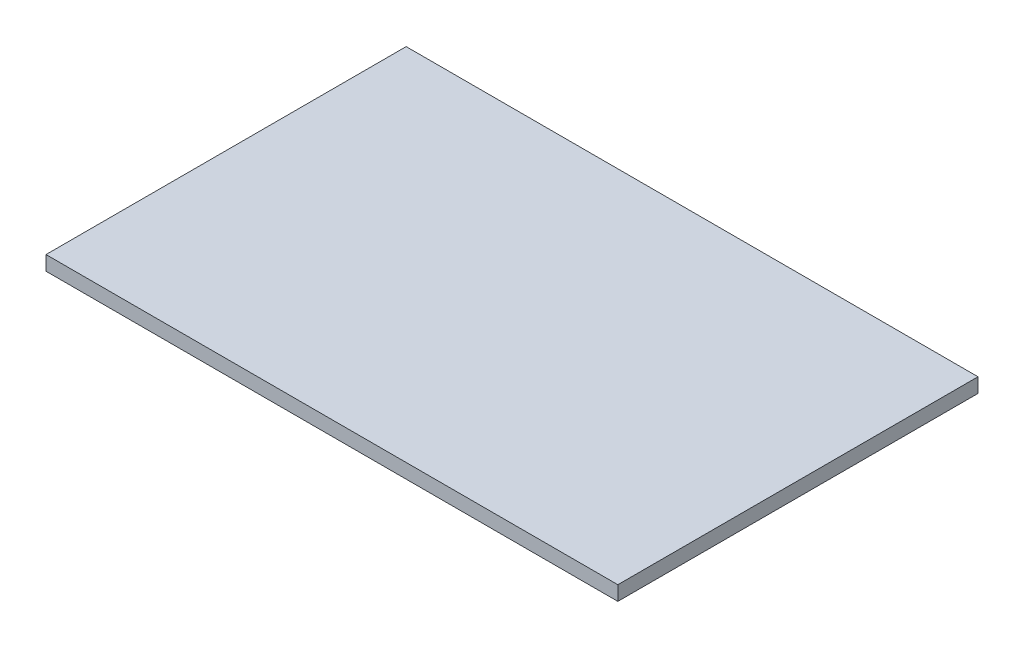
ISO-10303-21;
HEADER;
FILE_DESCRIPTION(('STEP AP214'),'2;1');
FILE_NAME('part.step','',(''),(''),'','','');
FILE_SCHEMA(('AUTOMOTIVE_DESIGN { 1 0 10303 214 1 1 1 1 }'));
ENDSEC;
DATA;
#1=APPLICATION_CONTEXT('core data for automotive mechanical design processes');
#2=APPLICATION_PROTOCOL_DEFINITION('international standard','automotive_design',2000,#1);
#3=PRODUCT_CONTEXT('',#1,'mechanical');
#4=PRODUCT('Part','Part','',(#3));
#5=PRODUCT_RELATED_PRODUCT_CATEGORY('part','',(#4));
#6=PRODUCT_DEFINITION_FORMATION('','',#4);
#7=PRODUCT_DEFINITION_CONTEXT('part definition',#1,'design');
#8=PRODUCT_DEFINITION('design','',#6,#7);
#9=PRODUCT_DEFINITION_SHAPE('','',#8);
#10=(LENGTH_UNIT() NAMED_UNIT(*) SI_UNIT(.MILLI.,.METRE.));
#11=(NAMED_UNIT(*) PLANE_ANGLE_UNIT() SI_UNIT($,.RADIAN.));
#12=(NAMED_UNIT(*) SI_UNIT($,.STERADIAN.) SOLID_ANGLE_UNIT());
#13=UNCERTAINTY_MEASURE_WITH_UNIT(LENGTH_MEASURE(1.E-05),#10,'distance_accuracy_value','');
#14=(GEOMETRIC_REPRESENTATION_CONTEXT(3) GLOBAL_UNCERTAINTY_ASSIGNED_CONTEXT((#13)) GLOBAL_UNIT_ASSIGNED_CONTEXT((#10,
#11,#12)) REPRESENTATION_CONTEXT('',''));
#15=CARTESIAN_POINT('',(0.,0.,0.));
#16=DIRECTION('',(0.,0.,1.));
#17=DIRECTION('',(1.,0.,0.));
#18=AXIS2_PLACEMENT_3D('',#15,#16,#17);
#19=CARTESIAN_POINT('',(-583.074534161491,38.,-466.459627329193));
#20=DIRECTION('',(1.,0.,0.));
#21=DIRECTION('',(0.,0.,-1.));
#22=AXIS2_PLACEMENT_3D('',#19,#20,#21);
#23=PLANE('',#22);
#24=DIRECTION('',(0.,0.,1.));
#25=VECTOR('',#24,1.);
#26=CARTESIAN_POINT('',(-583.074534161491,0.,-466.459627329193));
#27=LINE('',#26,#25);
#28=CARTESIAN_POINT('',(-583.074534161491,0.,-466.459627329193));
#29=VERTEX_POINT('',#28);
#30=CARTESIAN_POINT('',(-583.074534161491,0.,479.540372670807));
#31=VERTEX_POINT('',#30);
#32=EDGE_CURVE('E160',#29,#31,#27,.T.);
#33=ORIENTED_EDGE('',*,*,#32,.T.);
#34=DIRECTION('',(0.,-1.,0.));
#35=VECTOR('',#34,1.);
#36=CARTESIAN_POINT('',(-583.074534161491,38.,479.540372670807));
#37=LINE('',#36,#35);
#38=CARTESIAN_POINT('',(-583.074534161491,38.,479.540372670807));
#39=VERTEX_POINT('',#38);
#40=EDGE_CURVE('E11',#39,#31,#37,.T.);
#41=ORIENTED_EDGE('',*,*,#40,.F.);
#42=DIRECTION('',(0.,0.,1.));
#43=VECTOR('',#42,1.);
#44=CARTESIAN_POINT('',(-583.074534161491,38.,-466.459627329193));
#45=LINE('',#44,#43);
#46=CARTESIAN_POINT('',(-583.074534161491,38.,-466.459627329193));
#47=VERTEX_POINT('',#46);
#48=EDGE_CURVE('E166',#47,#39,#45,.T.);
#49=ORIENTED_EDGE('',*,*,#48,.F.);
#50=DIRECTION('',(0.,-1.,0.));
#51=VECTOR('',#50,1.);
#52=CARTESIAN_POINT('',(-583.074534161491,38.,-466.459627329193));
#53=LINE('',#52,#51);
#54=EDGE_CURVE('E67',#47,#29,#53,.T.);
#55=ORIENTED_EDGE('',*,*,#54,.T.);
#56=EDGE_LOOP('',(#33,#41,#49,#55));
#57=FACE_BOUND('',#56,.T.);
#58=ADVANCED_FACE('F43',(#57),#23,.F.);
#59=CARTESIAN_POINT('',(-583.074534161491,38.,479.540372670807));
#60=DIRECTION('',(0.,0.,-1.));
#61=DIRECTION('',(-1.,0.,0.));
#62=AXIS2_PLACEMENT_3D('',#59,#60,#61);
#63=PLANE('',#62);
#64=DIRECTION('',(1.,0.,0.));
#65=VECTOR('',#64,1.);
#66=CARTESIAN_POINT('',(-583.074534161491,0.,479.540372670807));
#67=LINE('',#66,#65);
#68=CARTESIAN_POINT('',(918.92546583851,0.,479.540372670807));
#69=VERTEX_POINT('',#68);
#70=EDGE_CURVE('E181',#31,#69,#67,.T.);
#71=ORIENTED_EDGE('',*,*,#70,.T.);
#72=DIRECTION('',(0.,-1.,0.));
#73=VECTOR('',#72,1.);
#74=CARTESIAN_POINT('',(918.92546583851,38.,479.540372670807));
#75=LINE('',#74,#73);
#76=CARTESIAN_POINT('',(918.92546583851,38.,479.540372670807));
#77=VERTEX_POINT('',#76);
#78=EDGE_CURVE('E51',#77,#69,#75,.T.);
#79=ORIENTED_EDGE('',*,*,#78,.F.);
#80=DIRECTION('',(1.,0.,0.));
#81=VECTOR('',#80,1.);
#82=CARTESIAN_POINT('',(-583.074534161491,38.,479.540372670807));
#83=LINE('',#82,#81);
#84=EDGE_CURVE('E93',#39,#77,#83,.T.);
#85=ORIENTED_EDGE('',*,*,#84,.F.);
#86=ORIENTED_EDGE('',*,*,#40,.T.);
#87=EDGE_LOOP('',(#71,#79,#85,#86));
#88=FACE_BOUND('',#87,.T.);
#89=ADVANCED_FACE('F201',(#88),#63,.F.);
#90=CARTESIAN_POINT('',(918.925465838509,38.,-466.459627329193));
#91=DIRECTION('',(1.,0.,0.));
#92=DIRECTION('',(0.,0.,-1.));
#93=AXIS2_PLACEMENT_3D('',#90,#91,#92);
#94=PLANE('',#93);
#95=DIRECTION('',(0.,0.,1.));
#96=VECTOR('',#95,1.);
#97=CARTESIAN_POINT('',(918.925465838509,0.,-466.459627329193));
#98=LINE('',#97,#96);
#99=CARTESIAN_POINT('',(918.925465838509,0.,-466.459627329193));
#100=VERTEX_POINT('',#99);
#101=EDGE_CURVE('E185',#100,#69,#98,.T.);
#102=ORIENTED_EDGE('',*,*,#101,.F.);
#103=DIRECTION('',(0.,-1.,0.));
#104=VECTOR('',#103,1.);
#105=CARTESIAN_POINT('',(918.925465838509,38.,-466.459627329193));
#106=LINE('',#105,#104);
#107=CARTESIAN_POINT('',(918.925465838509,38.,-466.459627329193));
#108=VERTEX_POINT('',#107);
#109=EDGE_CURVE('E194',#108,#100,#106,.T.);
#110=ORIENTED_EDGE('',*,*,#109,.F.);
#111=DIRECTION('',(0.,0.,1.));
#112=VECTOR('',#111,1.);
#113=CARTESIAN_POINT('',(918.925465838509,38.,-466.459627329193));
#114=LINE('',#113,#112);
#115=EDGE_CURVE('E172',#108,#77,#114,.T.);
#116=ORIENTED_EDGE('',*,*,#115,.T.);
#117=ORIENTED_EDGE('',*,*,#78,.T.);
#118=EDGE_LOOP('',(#102,#110,#116,#117));
#119=FACE_BOUND('',#118,.T.);
#120=ADVANCED_FACE('F199',(#119),#94,.T.);
#121=CARTESIAN_POINT('',(-583.074534161491,38.,-466.459627329193));
#122=DIRECTION('',(0.,0.,-1.));
#123=DIRECTION('',(-1.,0.,0.));
#124=AXIS2_PLACEMENT_3D('',#121,#122,#123);
#125=PLANE('',#124);
#126=DIRECTION('',(1.,0.,0.));
#127=VECTOR('',#126,1.);
#128=CARTESIAN_POINT('',(-583.074534161491,0.,-466.459627329193));
#129=LINE('',#128,#127);
#130=EDGE_CURVE('E169',#29,#100,#129,.T.);
#131=ORIENTED_EDGE('',*,*,#130,.F.);
#132=ORIENTED_EDGE('',*,*,#54,.F.);
#133=DIRECTION('',(1.,0.,0.));
#134=VECTOR('',#133,1.);
#135=CARTESIAN_POINT('',(-583.074534161491,38.,-466.459627329193));
#136=LINE('',#135,#134);
#137=EDGE_CURVE('E176',#47,#108,#136,.T.);
#138=ORIENTED_EDGE('',*,*,#137,.T.);
#139=ORIENTED_EDGE('',*,*,#109,.T.);
#140=EDGE_LOOP('',(#131,#132,#138,#139));
#141=FACE_BOUND('',#140,.T.);
#142=ADVANCED_FACE('F205',(#141),#125,.T.);
#143=CARTESIAN_POINT('',(0.,38.,0.));
#144=DIRECTION('',(0.,1.,0.));
#145=DIRECTION('',(0.,0.,1.));
#146=AXIS2_PLACEMENT_3D('',#143,#144,#145);
#147=PLANE('',#146);
#148=ORIENTED_EDGE('',*,*,#48,.T.);
#149=ORIENTED_EDGE('',*,*,#84,.T.);
#150=ORIENTED_EDGE('',*,*,#115,.F.);
#151=ORIENTED_EDGE('',*,*,#137,.F.);
#152=EDGE_LOOP('',(#148,#149,#150,#151));
#153=FACE_BOUND('',#152,.T.);
#154=ADVANCED_FACE('F208',(#153),#147,.T.);
#155=CARTESIAN_POINT('',(0.,0.,0.));
#156=DIRECTION('',(0.,1.,0.));
#157=DIRECTION('',(0.,0.,1.));
#158=AXIS2_PLACEMENT_3D('',#155,#156,#157);
#159=PLANE('',#158);
#160=DIRECTION('',(0.,0.,1.));
#161=VECTOR('',#160,1.);
#162=CARTESIAN_POINT('',(868.925465838509,0.,-416.459627329193));
#163=LINE('',#162,#161);
#164=CARTESIAN_POINT('',(868.925465838509,0.,-416.459627329193));
#165=VERTEX_POINT('',#164);
#166=CARTESIAN_POINT('',(868.925465838509,0.,429.540372670807));
#167=VERTEX_POINT('',#166);
#168=EDGE_CURVE('E151',#165,#167,#163,.T.);
#169=ORIENTED_EDGE('',*,*,#168,.F.);
#170=DIRECTION('',(1.,0.,0.));
#171=VECTOR('',#170,1.);
#172=CARTESIAN_POINT('',(-533.074534161491,0.,-416.459627329193));
#173=LINE('',#172,#171);
#174=CARTESIAN_POINT('',(-533.074534161491,0.,-416.459627329193));
#175=VERTEX_POINT('',#174);
#176=EDGE_CURVE('E58',#175,#165,#173,.T.);
#177=ORIENTED_EDGE('',*,*,#176,.F.);
#178=DIRECTION('',(0.,0.,1.));
#179=VECTOR('',#178,1.);
#180=CARTESIAN_POINT('',(-533.074534161491,0.,-416.459627329193));
#181=LINE('',#180,#179);
#182=CARTESIAN_POINT('',(-533.074534161491,0.,429.540372670807));
#183=VERTEX_POINT('',#182);
#184=EDGE_CURVE('E138',#175,#183,#181,.T.);
#185=ORIENTED_EDGE('',*,*,#184,.T.);
#186=DIRECTION('',(1.,0.,0.));
#187=VECTOR('',#186,1.);
#188=CARTESIAN_POINT('',(-533.074534161491,0.,429.540372670807));
#189=LINE('',#188,#187);
#190=EDGE_CURVE('E142',#183,#167,#189,.T.);
#191=ORIENTED_EDGE('',*,*,#190,.T.);
#192=EDGE_LOOP('',(#169,#177,#185,#191));
#193=FACE_BOUND('',#192,.T.);
#194=ORIENTED_EDGE('',*,*,#32,.F.);
#195=ORIENTED_EDGE('',*,*,#130,.T.);
#196=ORIENTED_EDGE('',*,*,#101,.T.);
#197=ORIENTED_EDGE('',*,*,#70,.F.);
#198=EDGE_LOOP('',(#194,#195,#196,#197));
#199=FACE_BOUND('',#198,.T.);
#200=ADVANCED_FACE('F204',(#193,#199),#159,.F.);
#201=CARTESIAN_POINT('',(-533.074534161491,30.,-416.459627329193));
#202=DIRECTION('',(0.,0.,-1.));
#203=DIRECTION('',(-1.,0.,0.));
#204=AXIS2_PLACEMENT_3D('',#201,#202,#203);
#205=PLANE('',#204);
#206=ORIENTED_EDGE('',*,*,#176,.T.);
#207=DIRECTION('',(0.,-1.,0.));
#208=VECTOR('',#207,1.);
#209=CARTESIAN_POINT('',(868.925465838509,30.,-416.459627329193));
#210=LINE('',#209,#208);
#211=CARTESIAN_POINT('',(868.925465838509,30.,-416.459627329193));
#212=VERTEX_POINT('',#211);
#213=EDGE_CURVE('E114',#212,#165,#210,.T.);
#214=ORIENTED_EDGE('',*,*,#213,.F.);
#215=DIRECTION('',(1.,0.,0.));
#216=VECTOR('',#215,1.);
#217=CARTESIAN_POINT('',(-533.074534161491,30.,-416.459627329193));
#218=LINE('',#217,#216);
#219=CARTESIAN_POINT('',(-533.074534161491,30.,-416.459627329193));
#220=VERTEX_POINT('',#219);
#221=EDGE_CURVE('E118',#220,#212,#218,.T.);
#222=ORIENTED_EDGE('',*,*,#221,.F.);
#223=DIRECTION('',(0.,-1.,0.));
#224=VECTOR('',#223,1.);
#225=CARTESIAN_POINT('',(-533.074534161491,30.,-416.459627329193));
#226=LINE('',#225,#224);
#227=EDGE_CURVE('E157',#220,#175,#226,.T.);
#228=ORIENTED_EDGE('',*,*,#227,.T.);
#229=EDGE_LOOP('',(#206,#214,#222,#228));
#230=FACE_BOUND('',#229,.T.);
#231=ADVANCED_FACE('F116',(#230),#205,.F.);
#232=CARTESIAN_POINT('',(-533.074534161491,30.,-416.459627329193));
#233=DIRECTION('',(1.,0.,0.));
#234=DIRECTION('',(0.,0.,-1.));
#235=AXIS2_PLACEMENT_3D('',#232,#233,#234);
#236=PLANE('',#235);
#237=ORIENTED_EDGE('',*,*,#184,.F.);
#238=ORIENTED_EDGE('',*,*,#227,.F.);
#239=DIRECTION('',(0.,0.,1.));
#240=VECTOR('',#239,1.);
#241=CARTESIAN_POINT('',(-533.074534161491,30.,-416.459627329193));
#242=LINE('',#241,#240);
#243=CARTESIAN_POINT('',(-533.074534161491,30.,429.540372670807));
#244=VERTEX_POINT('',#243);
#245=EDGE_CURVE('E124',#220,#244,#242,.T.);
#246=ORIENTED_EDGE('',*,*,#245,.T.);
#247=DIRECTION('',(0.,-1.,0.));
#248=VECTOR('',#247,1.);
#249=CARTESIAN_POINT('',(-533.074534161491,30.,429.540372670807));
#250=LINE('',#249,#248);
#251=EDGE_CURVE('E161',#244,#183,#250,.T.);
#252=ORIENTED_EDGE('',*,*,#251,.T.);
#253=EDGE_LOOP('',(#237,#238,#246,#252));
#254=FACE_BOUND('',#253,.T.);
#255=ADVANCED_FACE('F227',(#254),#236,.T.);
#256=CARTESIAN_POINT('',(-533.074534161491,30.,429.540372670807));
#257=DIRECTION('',(0.,0.,-1.));
#258=DIRECTION('',(-1.,0.,0.));
#259=AXIS2_PLACEMENT_3D('',#256,#257,#258);
#260=PLANE('',#259);
#261=ORIENTED_EDGE('',*,*,#190,.F.);
#262=ORIENTED_EDGE('',*,*,#251,.F.);
#263=DIRECTION('',(1.,0.,0.));
#264=VECTOR('',#263,1.);
#265=CARTESIAN_POINT('',(-533.074534161491,30.,429.540372670807));
#266=LINE('',#265,#264);
#267=CARTESIAN_POINT('',(868.925465838509,30.,429.540372670807));
#268=VERTEX_POINT('',#267);
#269=EDGE_CURVE('E133',#244,#268,#266,.T.);
#270=ORIENTED_EDGE('',*,*,#269,.T.);
#271=DIRECTION('',(0.,-1.,0.));
#272=VECTOR('',#271,1.);
#273=CARTESIAN_POINT('',(868.925465838509,30.,429.540372670807));
#274=LINE('',#273,#272);
#275=EDGE_CURVE('E123',#268,#167,#274,.T.);
#276=ORIENTED_EDGE('',*,*,#275,.T.);
#277=EDGE_LOOP('',(#261,#262,#270,#276));
#278=FACE_BOUND('',#277,.T.);
#279=ADVANCED_FACE('F230',(#278),#260,.T.);
#280=CARTESIAN_POINT('',(868.925465838509,30.,-416.459627329193));
#281=DIRECTION('',(1.,0.,0.));
#282=DIRECTION('',(0.,0.,-1.));
#283=AXIS2_PLACEMENT_3D('',#280,#281,#282);
#284=PLANE('',#283);
#285=ORIENTED_EDGE('',*,*,#168,.T.);
#286=ORIENTED_EDGE('',*,*,#275,.F.);
#287=DIRECTION('',(0.,0.,1.));
#288=VECTOR('',#287,1.);
#289=CARTESIAN_POINT('',(868.925465838509,30.,-416.459627329193));
#290=LINE('',#289,#288);
#291=EDGE_CURVE('E128',#212,#268,#290,.T.);
#292=ORIENTED_EDGE('',*,*,#291,.F.);
#293=ORIENTED_EDGE('',*,*,#213,.T.);
#294=EDGE_LOOP('',(#285,#286,#292,#293));
#295=FACE_BOUND('',#294,.T.);
#296=ADVANCED_FACE('F129',(#295),#284,.F.);
#297=CARTESIAN_POINT('',(0.,30.,0.));
#298=DIRECTION('',(0.,-1.,0.));
#299=DIRECTION('',(0.,0.,-1.));
#300=AXIS2_PLACEMENT_3D('',#297,#298,#299);
#301=PLANE('',#300);
#302=ORIENTED_EDGE('',*,*,#221,.T.);
#303=ORIENTED_EDGE('',*,*,#291,.T.);
#304=ORIENTED_EDGE('',*,*,#269,.F.);
#305=ORIENTED_EDGE('',*,*,#245,.F.);
#306=EDGE_LOOP('',(#302,#303,#304,#305));
#307=FACE_BOUND('',#306,.T.);
#308=ADVANCED_FACE('F136',(#307),#301,.T.);
#309=CLOSED_SHELL('',(#58,#89,#120,#142,#154,#200,#231,#255,#279,#296,#308));
#310=MANIFOLD_SOLID_BREP('B2',#309);
#311=ADVANCED_BREP_SHAPE_REPRESENTATION('',(#18,#310),#14);
#312=SHAPE_DEFINITION_REPRESENTATION(#9,#311);
ENDSEC;
END-ISO-10303-21;
